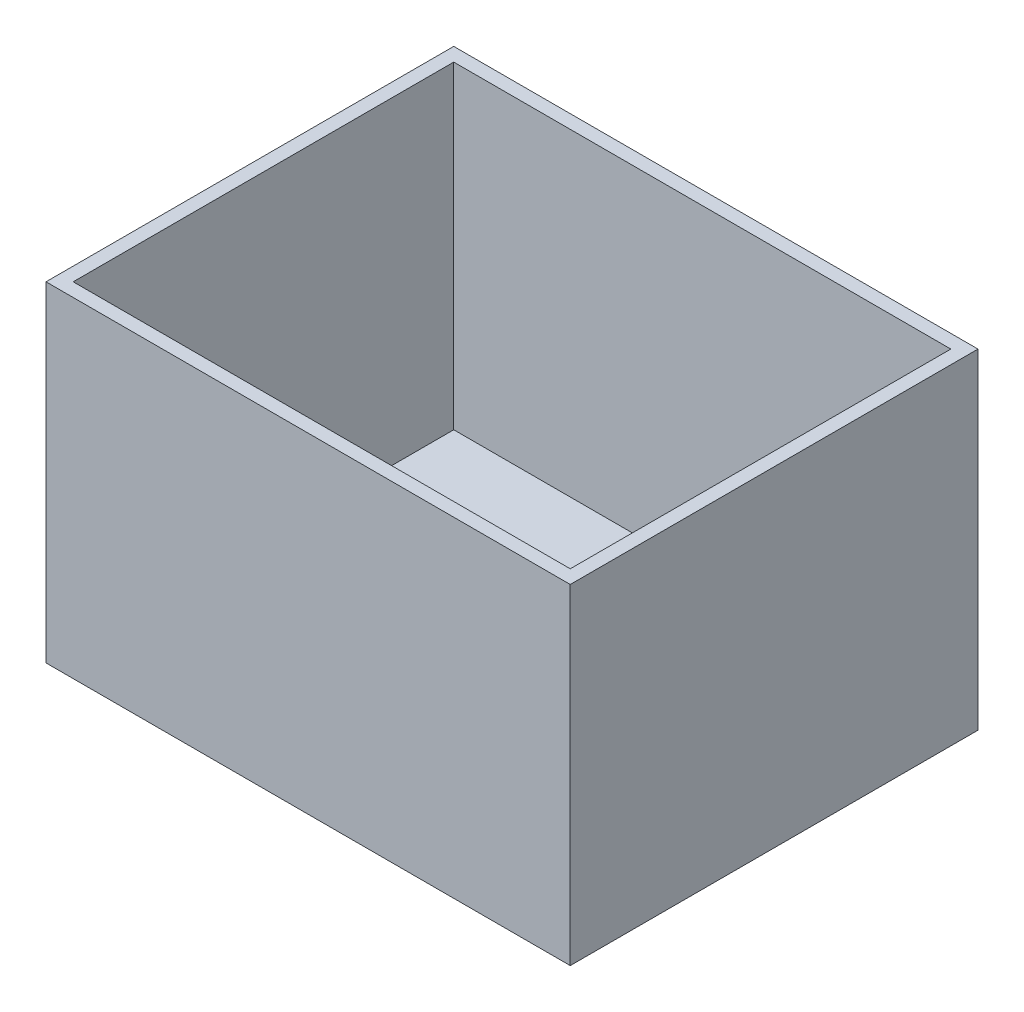
ISO-10303-21;
HEADER;
FILE_DESCRIPTION(('STEP AP214'),'2;1');
FILE_NAME('part.step','',(''),(''),'','','');
FILE_SCHEMA(('AUTOMOTIVE_DESIGN { 1 0 10303 214 1 1 1 1 }'));
ENDSEC;
DATA;
#1=APPLICATION_CONTEXT('core data for automotive mechanical design processes');
#2=APPLICATION_PROTOCOL_DEFINITION('international standard','automotive_design',2000,#1);
#3=PRODUCT_CONTEXT('',#1,'mechanical');
#4=PRODUCT('Part','Part','',(#3));
#5=PRODUCT_RELATED_PRODUCT_CATEGORY('part','',(#4));
#6=PRODUCT_DEFINITION_FORMATION('','',#4);
#7=PRODUCT_DEFINITION_CONTEXT('part definition',#1,'design');
#8=PRODUCT_DEFINITION('design','',#6,#7);
#9=PRODUCT_DEFINITION_SHAPE('','',#8);
#10=(LENGTH_UNIT() NAMED_UNIT(*) SI_UNIT(.MILLI.,.METRE.));
#11=(NAMED_UNIT(*) PLANE_ANGLE_UNIT() SI_UNIT($,.RADIAN.));
#12=(NAMED_UNIT(*) SI_UNIT($,.STERADIAN.) SOLID_ANGLE_UNIT());
#13=UNCERTAINTY_MEASURE_WITH_UNIT(LENGTH_MEASURE(1.E-05),#10,'distance_accuracy_value','');
#14=(GEOMETRIC_REPRESENTATION_CONTEXT(3) GLOBAL_UNCERTAINTY_ASSIGNED_CONTEXT((#13)) GLOBAL_UNIT_ASSIGNED_CONTEXT((#10,
#11,#12)) REPRESENTATION_CONTEXT('',''));
#15=CARTESIAN_POINT('',(0.,0.,0.));
#16=DIRECTION('',(0.,0.,1.));
#17=DIRECTION('',(1.,0.,0.));
#18=AXIS2_PLACEMENT_3D('',#15,#16,#17);
#19=CARTESIAN_POINT('',(-128.,170.,98.));
#20=DIRECTION('',(1.,0.,0.));
#21=DIRECTION('',(0.,0.,-1.));
#22=AXIS2_PLACEMENT_3D('',#19,#20,#21);
#23=PLANE('',#22);
#24=DIRECTION('',(0.,-1.,0.));
#25=VECTOR('',#24,1.);
#26=CARTESIAN_POINT('',(-128.,170.,98.));
#27=LINE('',#26,#25);
#28=CARTESIAN_POINT('',(-128.,170.,98.));
#29=VERTEX_POINT('',#28);
#30=CARTESIAN_POINT('',(-128.,6.00000000000001,98.));
#31=VERTEX_POINT('',#30);
#32=EDGE_CURVE('E112',#29,#31,#27,.T.);
#33=ORIENTED_EDGE('',*,*,#32,.T.);
#34=DIRECTION('',(0.,0.,-1.));
#35=VECTOR('',#34,1.);
#36=CARTESIAN_POINT('',(-128.,6.00000000000001,98.));
#37=LINE('',#36,#35);
#38=CARTESIAN_POINT('',(-128.,6.00000000000001,-98.));
#39=VERTEX_POINT('',#38);
#40=EDGE_CURVE('E105',#31,#39,#37,.T.);
#41=ORIENTED_EDGE('',*,*,#40,.T.);
#42=DIRECTION('',(0.,-1.,0.));
#43=VECTOR('',#42,1.);
#44=CARTESIAN_POINT('',(-128.,170.,-98.));
#45=LINE('',#44,#43);
#46=CARTESIAN_POINT('',(-128.,170.,-98.));
#47=VERTEX_POINT('',#46);
#48=EDGE_CURVE('E106',#47,#39,#45,.T.);
#49=ORIENTED_EDGE('',*,*,#48,.F.);
#50=DIRECTION('',(0.,0.,1.));
#51=VECTOR('',#50,1.);
#52=CARTESIAN_POINT('',(-128.,170.,98.));
#53=LINE('',#52,#51);
#54=EDGE_CURVE('E115',#47,#29,#53,.T.);
#55=ORIENTED_EDGE('',*,*,#54,.T.);
#56=EDGE_LOOP('',(#33,#41,#49,#55));
#57=FACE_BOUND('',#56,.T.);
#58=ADVANCED_FACE('F39',(#57),#23,.T.);
#59=CARTESIAN_POINT('',(-128.,170.,98.));
#60=DIRECTION('',(0.,0.,-1.));
#61=DIRECTION('',(-1.,0.,0.));
#62=AXIS2_PLACEMENT_3D('',#59,#60,#61);
#63=PLANE('',#62);
#64=DIRECTION('',(0.,-1.,0.));
#65=VECTOR('',#64,1.);
#66=CARTESIAN_POINT('',(128.,170.,98.));
#67=LINE('',#66,#65);
#68=CARTESIAN_POINT('',(128.,170.,98.));
#69=VERTEX_POINT('',#68);
#70=CARTESIAN_POINT('',(128.,6.00000000000001,98.));
#71=VERTEX_POINT('',#70);
#72=EDGE_CURVE('E117',#69,#71,#67,.T.);
#73=ORIENTED_EDGE('',*,*,#72,.T.);
#74=DIRECTION('',(-1.,0.,0.));
#75=VECTOR('',#74,1.);
#76=CARTESIAN_POINT('',(-128.,6.00000000000001,98.));
#77=LINE('',#76,#75);
#78=EDGE_CURVE('E111',#71,#31,#77,.T.);
#79=ORIENTED_EDGE('',*,*,#78,.T.);
#80=ORIENTED_EDGE('',*,*,#32,.F.);
#81=DIRECTION('',(1.,0.,0.));
#82=VECTOR('',#81,1.);
#83=CARTESIAN_POINT('',(-128.,170.,98.));
#84=LINE('',#83,#82);
#85=EDGE_CURVE('E181',#29,#69,#84,.T.);
#86=ORIENTED_EDGE('',*,*,#85,.T.);
#87=EDGE_LOOP('',(#73,#79,#80,#86));
#88=FACE_BOUND('',#87,.T.);
#89=ADVANCED_FACE('F188',(#88),#63,.T.);
#90=CARTESIAN_POINT('',(128.,170.,98.));
#91=DIRECTION('',(-1.,0.,0.));
#92=DIRECTION('',(0.,0.,1.));
#93=AXIS2_PLACEMENT_3D('',#90,#91,#92);
#94=PLANE('',#93);
#95=DIRECTION('',(0.,-1.,0.));
#96=VECTOR('',#95,1.);
#97=CARTESIAN_POINT('',(128.,170.,-98.));
#98=LINE('',#97,#96);
#99=CARTESIAN_POINT('',(128.,170.,-98.));
#100=VERTEX_POINT('',#99);
#101=CARTESIAN_POINT('',(128.,6.00000000000001,-98.));
#102=VERTEX_POINT('',#101);
#103=EDGE_CURVE('E58',#100,#102,#98,.T.);
#104=ORIENTED_EDGE('',*,*,#103,.T.);
#105=DIRECTION('',(0.,0.,1.));
#106=VECTOR('',#105,1.);
#107=CARTESIAN_POINT('',(128.,6.00000000000001,98.));
#108=LINE('',#107,#106);
#109=EDGE_CURVE('E53',#102,#71,#108,.T.);
#110=ORIENTED_EDGE('',*,*,#109,.T.);
#111=ORIENTED_EDGE('',*,*,#72,.F.);
#112=DIRECTION('',(0.,0.,-1.));
#113=VECTOR('',#112,1.);
#114=CARTESIAN_POINT('',(128.,170.,98.));
#115=LINE('',#114,#113);
#116=EDGE_CURVE('E123',#69,#100,#115,.T.);
#117=ORIENTED_EDGE('',*,*,#116,.T.);
#118=EDGE_LOOP('',(#104,#110,#111,#117));
#119=FACE_BOUND('',#118,.T.);
#120=ADVANCED_FACE('F190',(#119),#94,.T.);
#121=CARTESIAN_POINT('',(-128.,170.,-98.));
#122=DIRECTION('',(0.,0.,1.));
#123=DIRECTION('',(1.,0.,0.));
#124=AXIS2_PLACEMENT_3D('',#121,#122,#123);
#125=PLANE('',#124);
#126=ORIENTED_EDGE('',*,*,#48,.T.);
#127=DIRECTION('',(1.,0.,0.));
#128=VECTOR('',#127,1.);
#129=CARTESIAN_POINT('',(-128.,6.00000000000001,-98.));
#130=LINE('',#129,#128);
#131=EDGE_CURVE('E11',#39,#102,#130,.T.);
#132=ORIENTED_EDGE('',*,*,#131,.T.);
#133=ORIENTED_EDGE('',*,*,#103,.F.);
#134=DIRECTION('',(-1.,0.,0.));
#135=VECTOR('',#134,1.);
#136=CARTESIAN_POINT('',(-128.,170.,-98.));
#137=LINE('',#136,#135);
#138=EDGE_CURVE('E120',#100,#47,#137,.T.);
#139=ORIENTED_EDGE('',*,*,#138,.T.);
#140=EDGE_LOOP('',(#126,#132,#133,#139));
#141=FACE_BOUND('',#140,.T.);
#142=ADVANCED_FACE('F113',(#141),#125,.T.);
#143=CARTESIAN_POINT('',(0.,170.,0.));
#144=DIRECTION('',(0.,-1.,0.));
#145=DIRECTION('',(0.,0.,-1.));
#146=AXIS2_PLACEMENT_3D('',#143,#144,#145);
#147=PLANE('',#146);
#148=DIRECTION('',(0.,0.,1.));
#149=VECTOR('',#148,1.);
#150=CARTESIAN_POINT('',(-135.,170.,105.));
#151=LINE('',#150,#149);
#152=CARTESIAN_POINT('',(-135.,170.,-105.));
#153=VERTEX_POINT('',#152);
#154=CARTESIAN_POINT('',(-135.,170.,105.));
#155=VERTEX_POINT('',#154);
#156=EDGE_CURVE('E129',#153,#155,#151,.T.);
#157=ORIENTED_EDGE('',*,*,#156,.T.);
#158=DIRECTION('',(1.,0.,0.));
#159=VECTOR('',#158,1.);
#160=CARTESIAN_POINT('',(-135.,170.,105.));
#161=LINE('',#160,#159);
#162=CARTESIAN_POINT('',(135.,170.,105.));
#163=VERTEX_POINT('',#162);
#164=EDGE_CURVE('E135',#155,#163,#161,.T.);
#165=ORIENTED_EDGE('',*,*,#164,.T.);
#166=DIRECTION('',(0.,0.,-1.));
#167=VECTOR('',#166,1.);
#168=CARTESIAN_POINT('',(135.,170.,105.));
#169=LINE('',#168,#167);
#170=CARTESIAN_POINT('',(135.,170.,-105.));
#171=VERTEX_POINT('',#170);
#172=EDGE_CURVE('E134',#163,#171,#169,.T.);
#173=ORIENTED_EDGE('',*,*,#172,.T.);
#174=DIRECTION('',(-1.,0.,0.));
#175=VECTOR('',#174,1.);
#176=CARTESIAN_POINT('',(-135.,170.,-105.));
#177=LINE('',#176,#175);
#178=EDGE_CURVE('E140',#171,#153,#177,.T.);
#179=ORIENTED_EDGE('',*,*,#178,.T.);
#180=EDGE_LOOP('',(#157,#165,#173,#179));
#181=FACE_BOUND('',#180,.T.);
#182=ORIENTED_EDGE('',*,*,#54,.F.);
#183=ORIENTED_EDGE('',*,*,#138,.F.);
#184=ORIENTED_EDGE('',*,*,#116,.F.);
#185=ORIENTED_EDGE('',*,*,#85,.F.);
#186=EDGE_LOOP('',(#182,#183,#184,#185));
#187=FACE_BOUND('',#186,.T.);
#188=ADVANCED_FACE('F172',(#181,#187),#147,.F.);
#189=CARTESIAN_POINT('',(0.,0.,0.));
#190=DIRECTION('',(0.,-1.,0.));
#191=DIRECTION('',(0.,0.,-1.));
#192=AXIS2_PLACEMENT_3D('',#189,#190,#191);
#193=PLANE('',#192);
#194=DIRECTION('',(0.,0.,1.));
#195=VECTOR('',#194,1.);
#196=CARTESIAN_POINT('',(-135.,0.,105.));
#197=LINE('',#196,#195);
#198=CARTESIAN_POINT('',(-135.,0.,-105.));
#199=VERTEX_POINT('',#198);
#200=CARTESIAN_POINT('',(-135.,0.,105.));
#201=VERTEX_POINT('',#200);
#202=EDGE_CURVE('E126',#199,#201,#197,.T.);
#203=ORIENTED_EDGE('',*,*,#202,.F.);
#204=DIRECTION('',(-1.,0.,0.));
#205=VECTOR('',#204,1.);
#206=CARTESIAN_POINT('',(-135.,0.,-105.));
#207=LINE('',#206,#205);
#208=CARTESIAN_POINT('',(135.,0.,-105.));
#209=VERTEX_POINT('',#208);
#210=EDGE_CURVE('E133',#209,#199,#207,.T.);
#211=ORIENTED_EDGE('',*,*,#210,.F.);
#212=DIRECTION('',(0.,0.,-1.));
#213=VECTOR('',#212,1.);
#214=CARTESIAN_POINT('',(135.,0.,105.));
#215=LINE('',#214,#213);
#216=CARTESIAN_POINT('',(135.,0.,105.));
#217=VERTEX_POINT('',#216);
#218=EDGE_CURVE('E144',#217,#209,#215,.T.);
#219=ORIENTED_EDGE('',*,*,#218,.F.);
#220=DIRECTION('',(1.,0.,0.));
#221=VECTOR('',#220,1.);
#222=CARTESIAN_POINT('',(-135.,0.,105.));
#223=LINE('',#222,#221);
#224=EDGE_CURVE('E145',#201,#217,#223,.T.);
#225=ORIENTED_EDGE('',*,*,#224,.F.);
#226=EDGE_LOOP('',(#203,#211,#219,#225));
#227=FACE_BOUND('',#226,.T.);
#228=ADVANCED_FACE('F162',(#227),#193,.T.);
#229=CARTESIAN_POINT('',(-135.,170.,105.));
#230=DIRECTION('',(1.,0.,0.));
#231=DIRECTION('',(0.,0.,-1.));
#232=AXIS2_PLACEMENT_3D('',#229,#230,#231);
#233=PLANE('',#232);
#234=DIRECTION('',(0.,-1.,0.));
#235=VECTOR('',#234,1.);
#236=CARTESIAN_POINT('',(-135.,170.,-105.));
#237=LINE('',#236,#235);
#238=EDGE_CURVE('E137',#153,#199,#237,.T.);
#239=ORIENTED_EDGE('',*,*,#238,.T.);
#240=ORIENTED_EDGE('',*,*,#202,.T.);
#241=DIRECTION('',(0.,-1.,0.));
#242=VECTOR('',#241,1.);
#243=CARTESIAN_POINT('',(-135.,170.,105.));
#244=LINE('',#243,#242);
#245=EDGE_CURVE('E50',#155,#201,#244,.T.);
#246=ORIENTED_EDGE('',*,*,#245,.F.);
#247=ORIENTED_EDGE('',*,*,#156,.F.);
#248=EDGE_LOOP('',(#239,#240,#246,#247));
#249=FACE_BOUND('',#248,.T.);
#250=ADVANCED_FACE('F41',(#249),#233,.F.);
#251=CARTESIAN_POINT('',(-135.,170.,105.));
#252=DIRECTION('',(0.,0.,-1.));
#253=DIRECTION('',(-1.,0.,0.));
#254=AXIS2_PLACEMENT_3D('',#251,#252,#253);
#255=PLANE('',#254);
#256=ORIENTED_EDGE('',*,*,#245,.T.);
#257=ORIENTED_EDGE('',*,*,#224,.T.);
#258=DIRECTION('',(0.,-1.,0.));
#259=VECTOR('',#258,1.);
#260=CARTESIAN_POINT('',(135.,170.,105.));
#261=LINE('',#260,#259);
#262=EDGE_CURVE('E151',#163,#217,#261,.T.);
#263=ORIENTED_EDGE('',*,*,#262,.F.);
#264=ORIENTED_EDGE('',*,*,#164,.F.);
#265=EDGE_LOOP('',(#256,#257,#263,#264));
#266=FACE_BOUND('',#265,.T.);
#267=ADVANCED_FACE('F160',(#266),#255,.F.);
#268=CARTESIAN_POINT('',(135.,170.,105.));
#269=DIRECTION('',(-1.,0.,0.));
#270=DIRECTION('',(0.,0.,1.));
#271=AXIS2_PLACEMENT_3D('',#268,#269,#270);
#272=PLANE('',#271);
#273=ORIENTED_EDGE('',*,*,#262,.T.);
#274=ORIENTED_EDGE('',*,*,#218,.T.);
#275=DIRECTION('',(0.,-1.,0.));
#276=VECTOR('',#275,1.);
#277=CARTESIAN_POINT('',(135.,170.,-105.));
#278=LINE('',#277,#276);
#279=EDGE_CURVE('E153',#171,#209,#278,.T.);
#280=ORIENTED_EDGE('',*,*,#279,.F.);
#281=ORIENTED_EDGE('',*,*,#172,.F.);
#282=EDGE_LOOP('',(#273,#274,#280,#281));
#283=FACE_BOUND('',#282,.T.);
#284=ADVANCED_FACE('F171',(#283),#272,.F.);
#285=CARTESIAN_POINT('',(-135.,170.,-105.));
#286=DIRECTION('',(0.,0.,1.));
#287=DIRECTION('',(1.,0.,0.));
#288=AXIS2_PLACEMENT_3D('',#285,#286,#287);
#289=PLANE('',#288);
#290=ORIENTED_EDGE('',*,*,#279,.T.);
#291=ORIENTED_EDGE('',*,*,#210,.T.);
#292=ORIENTED_EDGE('',*,*,#238,.F.);
#293=ORIENTED_EDGE('',*,*,#178,.F.);
#294=EDGE_LOOP('',(#290,#291,#292,#293));
#295=FACE_BOUND('',#294,.T.);
#296=ADVANCED_FACE('F170',(#295),#289,.F.);
#297=CARTESIAN_POINT('',(0.,6.,0.));
#298=DIRECTION('',(0.,-1.,0.));
#299=DIRECTION('',(0.,0.,-1.));
#300=AXIS2_PLACEMENT_3D('',#297,#298,#299);
#301=PLANE('',#300);
#302=ORIENTED_EDGE('',*,*,#40,.F.);
#303=ORIENTED_EDGE('',*,*,#78,.F.);
#304=ORIENTED_EDGE('',*,*,#109,.F.);
#305=ORIENTED_EDGE('',*,*,#131,.F.);
#306=EDGE_LOOP('',(#302,#303,#304,#305));
#307=FACE_BOUND('',#306,.T.);
#308=ADVANCED_FACE('F102',(#307),#301,.F.);
#309=CLOSED_SHELL('',(#58,#89,#120,#142,#188,#228,#250,#267,#284,#296,#308));
#310=MANIFOLD_SOLID_BREP('B2',#309);
#311=ADVANCED_BREP_SHAPE_REPRESENTATION('',(#18,#310),#14);
#312=SHAPE_DEFINITION_REPRESENTATION(#9,#311);
ENDSEC;
END-ISO-10303-21;
